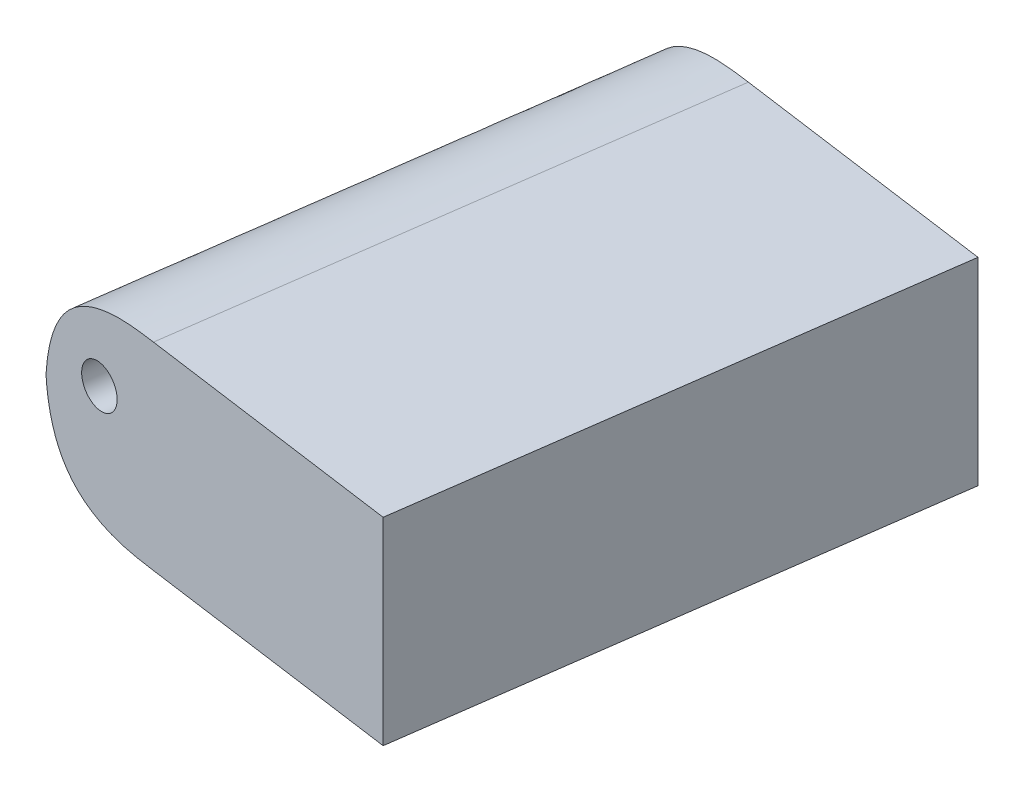
ISO-10303-21;
HEADER;
FILE_DESCRIPTION(('STEP AP214'),'2;1');
FILE_NAME('part.step','',(''),(''),'','','');
FILE_SCHEMA(('AUTOMOTIVE_DESIGN { 1 0 10303 214 1 1 1 1 }'));
ENDSEC;
DATA;
#1=APPLICATION_CONTEXT('core data for automotive mechanical design processes');
#2=APPLICATION_PROTOCOL_DEFINITION('international standard','automotive_design',2000,#1);
#3=PRODUCT_CONTEXT('',#1,'mechanical');
#4=PRODUCT('Part','Part','',(#3));
#5=PRODUCT_RELATED_PRODUCT_CATEGORY('part','',(#4));
#6=PRODUCT_DEFINITION_FORMATION('','',#4);
#7=PRODUCT_DEFINITION_CONTEXT('part definition',#1,'design');
#8=PRODUCT_DEFINITION('design','',#6,#7);
#9=PRODUCT_DEFINITION_SHAPE('','',#8);
#10=(LENGTH_UNIT() NAMED_UNIT(*) SI_UNIT(.MILLI.,.METRE.));
#11=(NAMED_UNIT(*) PLANE_ANGLE_UNIT() SI_UNIT($,.RADIAN.));
#12=(NAMED_UNIT(*) SI_UNIT($,.STERADIAN.) SOLID_ANGLE_UNIT());
#13=UNCERTAINTY_MEASURE_WITH_UNIT(LENGTH_MEASURE(1.E-05),#10,'distance_accuracy_value','');
#14=(GEOMETRIC_REPRESENTATION_CONTEXT(3) GLOBAL_UNCERTAINTY_ASSIGNED_CONTEXT((#13)) GLOBAL_UNIT_ASSIGNED_CONTEXT((#10,
#11,#12)) REPRESENTATION_CONTEXT('',''));
#15=CARTESIAN_POINT('',(0.,0.,0.));
#16=DIRECTION('',(0.,0.,1.));
#17=DIRECTION('',(1.,0.,0.));
#18=AXIS2_PLACEMENT_3D('',#15,#16,#17);
#19=CARTESIAN_POINT('',(-23.9416188893365,9.525,-6.04046528507022));
#20=DIRECTION('',(-0.990563834972414,0.,-0.137052139146913));
#21=DIRECTION('',(-0.137052139146913,0.,0.990563834972414));
#22=AXIS2_PLACEMENT_3D('',#19,#20,#21);
#23=PLANE('',#22);
#24=DIRECTION('',(0.137052139146913,0.,-0.990563834972414));
#25=VECTOR('',#24,1.);
#26=CARTESIAN_POINT('',(-23.9416188893365,0.,-6.04046528507022));
#27=LINE('',#26,#25);
#28=CARTESIAN_POINT('',(-27.4227432236681,0.,19.1198561232291));
#29=VERTEX_POINT('',#28);
#30=CARTESIAN_POINT('',(-23.9416188893365,0.,-6.04046528507022));
#31=VERTEX_POINT('',#30);
#32=EDGE_CURVE('E125',#29,#31,#27,.T.);
#33=ORIENTED_EDGE('',*,*,#32,.T.);
#34=DIRECTION('',(0.,-1.,0.));
#35=VECTOR('',#34,1.);
#36=CARTESIAN_POINT('',(-23.9416188893365,9.525,-6.04046528507022));
#37=LINE('',#36,#35);
#38=CARTESIAN_POINT('',(-23.9416188893365,9.525,-6.04046528507022));
#39=VERTEX_POINT('',#38);
#40=EDGE_CURVE('E106',#39,#31,#37,.T.);
#41=ORIENTED_EDGE('',*,*,#40,.F.);
#42=DIRECTION('',(0.137052139146913,0.,-0.990563834972414));
#43=VECTOR('',#42,1.);
#44=CARTESIAN_POINT('',(-23.9416188893365,9.525,-6.04046528507022));
#45=LINE('',#44,#43);
#46=CARTESIAN_POINT('',(-27.4227432236681,9.525,19.1198561232291));
#47=VERTEX_POINT('',#46);
#48=EDGE_CURVE('E114',#47,#39,#45,.T.);
#49=ORIENTED_EDGE('',*,*,#48,.F.);
#50=DIRECTION('',(0.,-1.,0.));
#51=VECTOR('',#50,1.);
#52=CARTESIAN_POINT('',(-27.4227432236681,9.525,19.1198561232291));
#53=LINE('',#52,#51);
#54=EDGE_CURVE('E127',#47,#29,#53,.T.);
#55=ORIENTED_EDGE('',*,*,#54,.T.);
#56=EDGE_LOOP('',(#33,#41,#49,#55));
#57=FACE_BOUND('',#56,.T.);
#58=ADVANCED_FACE('F49',(#57),#23,.F.);
#59=CARTESIAN_POINT('',(-42.8118599455609,9.525,-8.65130853581891));
#60=DIRECTION('',(-0.137052139146913,0.,0.990563834972414));
#61=DIRECTION('',(0.990563834972414,0.,0.137052139146913));
#62=AXIS2_PLACEMENT_3D('',#59,#60,#61);
#63=PLANE('',#62);
#64=CARTESIAN_POINT('',(-39.7967519465306,5.96899999999997,-8.23414511188111));
#65=DIRECTION('',(0.137052139146914,0.,-0.990563834972414));
#66=DIRECTION('',(-0.990563834972414,0.,-0.137052139146914));
#67=AXIS2_PLACEMENT_3D('',#64,#65,#66);
#68=CIRCLE('',#67,2.032);
#69=CARTESIAN_POINT('',(-41.8095776591946,5.96899999999997,-8.51263505862764));
#70=VERTEX_POINT('',#69);
#71=EDGE_CURVE('E135',#70,#70,#68,.T.);
#72=ORIENTED_EDGE('',*,*,#71,.F.);
#73=EDGE_LOOP('',(#72));
#74=FACE_BOUND('',#73,.T.);
#75=CARTESIAN_POINT('',(-42.8118599455608,6.096,-8.65130853582021));
#76=CARTESIAN_POINT('',(-42.8118599455549,5.07066467784526,-8.65130853581939));
#77=CARTESIAN_POINT('',(-42.8118599455549,4.04532935569003,-8.65130853581939));
#78=CARTESIAN_POINT('',(-42.3789499266729,1.78547706189416,-8.59141209900776));
#79=CARTESIAN_POINT('',(-41.0432309398884,0.437033943318146,-8.40660508508877));
#80=CARTESIAN_POINT('',(-38.80470298524,-2.28472537805387E-12,-8.09688749406616));
#81=CARTESIAN_POINT('',(-37.7890428964015,0.,-7.95636309482248));
#82=CARTESIAN_POINT('',(-36.773382807563,0.,-7.8158386955788));
#83=B_SPLINE_CURVE_WITH_KNOTS('',5,(#75,#76,#77,#78,#79,#80,#81,#82),.UNSPECIFIED.,.F.,.F.,(6,2,
6),(0.,0.5,1.),.UNSPECIFIED.);
#84=CARTESIAN_POINT('',(-36.7733828075631,0.,-7.81583869557849));
#85=VERTEX_POINT('',#84);
#86=CARTESIAN_POINT('',(-42.7789260117289,4.76250070250676,-8.64675187230784));
#87=VERTEX_POINT('',#86);
#88=EDGE_CURVE('E70',#85,#87,#83,.F.);
#89=ORIENTED_EDGE('',*,*,#88,.T.);
#90=CARTESIAN_POINT('',(-36.7733828075624,9.525,-7.8158386955805));
#91=CARTESIAN_POINT('',(-37.7890428964209,9.525,-7.95636309482418));
#92=CARTESIAN_POINT('',(-38.8047029852795,9.525,-8.09688749406785));
#93=CARTESIAN_POINT('',(-41.0432309398878,9.08796605667236,-8.40660508509113));
#94=CARTESIAN_POINT('',(-42.3789499266521,7.73952293812438,-8.59141209900377));
#95=CARTESIAN_POINT('',(-42.8118599455542,5.47967064431392,-8.65130853581607));
#96=CARTESIAN_POINT('',(-42.8118599455542,4.45433532215667,-8.65130853581607));
#97=CARTESIAN_POINT('',(-42.8118599455612,3.429,-8.65130853581704));
#98=B_SPLINE_CURVE_WITH_KNOTS('',5,(#90,#91,#92,#93,#94,#95,#96,#97),.UNSPECIFIED.,.F.,.F.,(6,2,
6),(0.,0.5,1.),.UNSPECIFIED.);
#99=CARTESIAN_POINT('',(-36.7733828075626,9.525,-7.81583869557843));
#100=VERTEX_POINT('',#99);
#101=EDGE_CURVE('E63',#87,#100,#98,.F.);
#102=ORIENTED_EDGE('',*,*,#101,.T.);
#103=DIRECTION('',(-0.990563834972414,0.,-0.137052139146913));
#104=VECTOR('',#103,1.);
#105=CARTESIAN_POINT('',(-42.8118599455609,9.525,-8.65130853581891));
#106=LINE('',#105,#104);
#107=EDGE_CURVE('E102',#39,#100,#106,.T.);
#108=ORIENTED_EDGE('',*,*,#107,.F.);
#109=ORIENTED_EDGE('',*,*,#40,.T.);
#110=DIRECTION('',(-0.990563834972414,0.,-0.137052139146913));
#111=VECTOR('',#110,1.);
#112=CARTESIAN_POINT('',(-42.8118599455609,0.,-8.65130853581891));
#113=LINE('',#112,#111);
#114=EDGE_CURVE('E146',#31,#85,#113,.T.);
#115=ORIENTED_EDGE('',*,*,#114,.T.);
#116=EDGE_LOOP('',(#89,#102,#108,#109,#115));
#117=FACE_BOUND('',#116,.T.);
#118=ADVANCED_FACE('F104',(#74,#117),#63,.F.);
#119=CARTESIAN_POINT('',(-27.4227432236681,9.525,19.1198561232291));
#120=DIRECTION('',(0.137052139146913,0.,-0.990563834972414));
#121=DIRECTION('',(-0.990563834972414,0.,-0.137052139146913));
#122=AXIS2_PLACEMENT_3D('',#119,#120,#121);
#123=PLANE('',#122);
#124=CARTESIAN_POINT('',(-43.2778762808622,5.96899999999997,16.9261762964182));
#125=DIRECTION('',(0.137052139146913,0.,-0.990563834972414));
#126=DIRECTION('',(-0.990563834972414,0.,-0.137052139146913));
#127=AXIS2_PLACEMENT_3D('',#124,#125,#126);
#128=CIRCLE('',#127,1.00000003200001);
#129=CARTESIAN_POINT('',(-44.2684401475327,5.96899999999997,16.7891241528856));
#130=VERTEX_POINT('',#129);
#131=EDGE_CURVE('E133',#130,#130,#128,.T.);
#132=ORIENTED_EDGE('',*,*,#131,.T.);
#133=EDGE_LOOP('',(#132));
#134=FACE_BOUND('',#133,.T.);
#135=DIRECTION('',(0.990563834972414,0.,0.137052139146913));
#136=VECTOR('',#135,1.);
#137=CARTESIAN_POINT('',(-27.4227432236681,9.525,19.1198561232291));
#138=LINE('',#137,#136);
#139=CARTESIAN_POINT('',(-40.2545071419075,9.525,17.344482712719));
#140=VERTEX_POINT('',#139);
#141=EDGE_CURVE('E113',#140,#47,#138,.T.);
#142=ORIENTED_EDGE('',*,*,#141,.F.);
#143=CARTESIAN_POINT('',(-46.2929842798927,3.429,16.5090128724816));
#144=CARTESIAN_POINT('',(-46.2929842798994,4.45433532214521,16.5090128724807));
#145=CARTESIAN_POINT('',(-46.2929842798994,5.47967064429194,16.5090128724807));
#146=CARTESIAN_POINT('',(-45.8600742609668,7.73952293811673,16.5689093093006));
#147=CARTESIAN_POINT('',(-44.5243552742101,9.08796605668191,16.7537163232018));
#148=CARTESIAN_POINT('',(-42.2858273195941,9.525,17.0634339142327));
#149=CARTESIAN_POINT('',(-41.2701672307509,9.525,17.2039583134764));
#150=CARTESIAN_POINT('',(-40.2545071419076,9.525,17.3444827127201));
#151=B_SPLINE_CURVE_WITH_KNOTS('',5,(#143,#144,#145,#146,#147,#148,#149,#150),.UNSPECIFIED.,.F.,
.F.,(6,2,6),(0.,0.5,1.),.UNSPECIFIED.);
#152=CARTESIAN_POINT('',(-46.2600539076306,4.76250261604928,16.5135690432208));
#153=VERTEX_POINT('',#152);
#154=EDGE_CURVE('E220',#140,#153,#151,.F.);
#155=ORIENTED_EDGE('',*,*,#154,.T.);
#156=CARTESIAN_POINT('',(-40.2545071419079,0.,17.3444827127202));
#157=CARTESIAN_POINT('',(-41.2701672307502,0.,17.2039583134765));
#158=CARTESIAN_POINT('',(-42.2858273195926,1.69313834773275E-12,17.0634339142328));
#159=CARTESIAN_POINT('',(-44.5243552742104,0.437033943321013,16.753716323216));
#160=CARTESIAN_POINT('',(-45.8600742609681,1.7854770618834,16.5689093092865));
#161=CARTESIAN_POINT('',(-46.2929842798998,4.04532935570675,16.5090128724805));
#162=CARTESIAN_POINT('',(-46.2929842798998,5.07066467785339,16.5090128724805));
#163=CARTESIAN_POINT('',(-46.2929842798927,6.096,16.5090128724815));
#164=B_SPLINE_CURVE_WITH_KNOTS('',5,(#156,#157,#158,#159,#160,#161,#162,#163),.UNSPECIFIED.,.F.,
.F.,(6,2,6),(0.,0.5,1.),.UNSPECIFIED.);
#165=CARTESIAN_POINT('',(-40.2545071419078,0.,17.344482712719));
#166=VERTEX_POINT('',#165);
#167=EDGE_CURVE('E129',#153,#166,#164,.F.);
#168=ORIENTED_EDGE('',*,*,#167,.T.);
#169=DIRECTION('',(0.990563834972414,0.,0.137052139146913));
#170=VECTOR('',#169,1.);
#171=CARTESIAN_POINT('',(-27.4227432236681,0.,19.1198561232291));
#172=LINE('',#171,#170);
#173=EDGE_CURVE('E122',#166,#29,#172,.T.);
#174=ORIENTED_EDGE('',*,*,#173,.T.);
#175=ORIENTED_EDGE('',*,*,#54,.F.);
#176=EDGE_LOOP('',(#142,#155,#168,#174,#175));
#177=FACE_BOUND('',#176,.T.);
#178=ADVANCED_FACE('F169',(#134,#177),#123,.F.);
#179=CARTESIAN_POINT('',(0.,9.525,0.));
#180=DIRECTION('',(0.,-1.,0.));
#181=DIRECTION('',(0.,0.,-1.));
#182=AXIS2_PLACEMENT_3D('',#179,#180,#181);
#183=PLANE('',#182);
#184=ORIENTED_EDGE('',*,*,#107,.T.);
#185=CARTESIAN_POINT('',(-40.4285633586173,9.525,18.602498783135));
#186=CARTESIAN_POINT('',(-39.1521511027523,9.525,9.3770476000811));
#187=CARTESIAN_POINT('',(-37.8757388467186,9.525,0.151596417051413));
#188=CARTESIAN_POINT('',(-36.5993265908525,9.525,-9.07385476599429));
#189=B_SPLINE_CURVE_WITH_KNOTS('',3,(#185,#186,#187,#188),.UNSPECIFIED.,.F.,.F.,(4,4),
(-0.00397221637437318,0.0239677836256268),.UNSPECIFIED.);
#190=EDGE_CURVE('E126',#100,#140,#189,.F.);
#191=ORIENTED_EDGE('',*,*,#190,.T.);
#192=ORIENTED_EDGE('',*,*,#141,.T.);
#193=ORIENTED_EDGE('',*,*,#48,.T.);
#194=EDGE_LOOP('',(#184,#191,#192,#193));
#195=FACE_BOUND('',#194,.T.);
#196=ADVANCED_FACE('F117',(#195),#183,.F.);
#197=CARTESIAN_POINT('',(0.,0.,0.));
#198=DIRECTION('',(0.,-1.,0.));
#199=DIRECTION('',(0.,0.,-1.));
#200=AXIS2_PLACEMENT_3D('',#197,#198,#199);
#201=PLANE('',#200);
#202=ORIENTED_EDGE('',*,*,#173,.F.);
#203=CARTESIAN_POINT('',(-36.5993265908525,0.,-9.0738547659943));
#204=CARTESIAN_POINT('',(-37.8757388467189,0.,0.151596417029174));
#205=CARTESIAN_POINT('',(-39.1521511027523,0.,9.37704760006494));
#206=CARTESIAN_POINT('',(-40.4285633586173,0.,18.602498783135));
#207=B_SPLINE_CURVE_WITH_KNOTS('',3,(#203,#204,#205,#206),.UNSPECIFIED.,.F.,.F.,(4,4),(-0.02667,
0.00127),.UNSPECIFIED.);
#208=EDGE_CURVE('E11',#166,#85,#207,.F.);
#209=ORIENTED_EDGE('',*,*,#208,.T.);
#210=ORIENTED_EDGE('',*,*,#114,.F.);
#211=ORIENTED_EDGE('',*,*,#32,.F.);
#212=EDGE_LOOP('',(#202,#209,#210,#211));
#213=FACE_BOUND('',#212,.T.);
#214=ADVANCED_FACE('F186',(#213),#201,.T.);
#215=CARTESIAN_POINT('',(-40.1667927222273,5.96899999999997,-5.5596227574556));
#216=DIRECTION('',(0.137052139146914,0.,-0.990563834972413));
#217=DIRECTION('',(-0.990563834972414,0.,-0.137052139146914));
#218=AXIS2_PLACEMENT_3D('',#215,#216,#217);
#219=CYLINDRICAL_SURFACE('',#218,2.032);
#220=CARTESIAN_POINT('',(-40.1667927222273,5.96899999999997,-5.5596227574556));
#221=DIRECTION('',(0.137052139146914,0.,-0.990563834972414));
#222=DIRECTION('',(-0.990563834972414,0.,-0.137052139146914));
#223=AXIS2_PLACEMENT_3D('',#220,#221,#222);
#224=CIRCLE('',#223,2.032);
#225=CARTESIAN_POINT('',(-42.1796184348912,5.96899999999997,-5.83811270420212));
#226=VERTEX_POINT('',#225);
#227=EDGE_CURVE('E147',#226,#226,#224,.T.);
#228=CARTESIAN_POINT('',(-42.1796184348912,5.96899999999997,-5.83811270420212));
#229=CARTESIAN_POINT('',(-42.1757638434777,5.96899999999997,-5.86597231206072));
#230=CARTESIAN_POINT('',(-42.1719092520642,5.96899999999997,-5.89383191991932));
#231=CARTESIAN_POINT('',(-42.1642000692372,5.96899999999997,-5.94955113563652));
#232=CARTESIAN_POINT('',(-42.1603454778237,5.96899999999997,-5.97741074349512));
#233=CARTESIAN_POINT('',(-42.1526362949967,5.96899999999997,-6.03312995921232));
#234=CARTESIAN_POINT('',(-42.1487817035832,5.96899999999997,-6.06098956707092));
#235=CARTESIAN_POINT('',(-42.1410725207562,5.96899999999997,-6.11670878278811));
#236=CARTESIAN_POINT('',(-42.1372179293427,5.96899999999997,-6.14456839064671));
#237=CARTESIAN_POINT('',(-42.1295087465157,5.96899999999997,-6.20028760636391));
#238=CARTESIAN_POINT('',(-42.1256541551021,5.96899999999997,-6.22814721422251));
#239=CARTESIAN_POINT('',(-42.1179449722751,5.96899999999997,-6.28386642993971));
#240=CARTESIAN_POINT('',(-42.1140903808616,5.96899999999997,-6.31172603779831));
#241=CARTESIAN_POINT('',(-42.1063811980346,5.96899999999997,-6.36744525351551));
#242=CARTESIAN_POINT('',(-42.1025266066211,5.96899999999997,-6.3953048613741));
#243=CARTESIAN_POINT('',(-42.0948174237941,5.96899999999997,-6.4510240770913));
#244=CARTESIAN_POINT('',(-42.0909628323806,5.96899999999997,-6.4788836849499));
#245=CARTESIAN_POINT('',(-42.0832536495536,5.96899999999997,-6.5346029006671));
#246=CARTESIAN_POINT('',(-42.0793990581401,5.96899999999997,-6.5624625085257));
#247=CARTESIAN_POINT('',(-42.071689875313,5.96899999999997,-6.6181817242429));
#248=CARTESIAN_POINT('',(-42.0678352838995,5.96899999999997,-6.6460413321015));
#249=CARTESIAN_POINT('',(-42.0601261010725,5.96899999999997,-6.7017605478187));
#250=CARTESIAN_POINT('',(-42.056271509659,5.96899999999997,-6.7296201556773));
#251=CARTESIAN_POINT('',(-42.048562326832,5.96899999999997,-6.78533937139449));
#252=CARTESIAN_POINT('',(-42.0447077354185,5.96899999999997,-6.81319897925309));
#253=CARTESIAN_POINT('',(-42.0369985525915,5.96899999999997,-6.86891819497029));
#254=CARTESIAN_POINT('',(-42.033143961178,5.96899999999997,-6.89677780282889));
#255=CARTESIAN_POINT('',(-42.025434778351,5.96899999999997,-6.95249701854609));
#256=CARTESIAN_POINT('',(-42.0215801869375,5.96899999999997,-6.98035662640469));
#257=CARTESIAN_POINT('',(-42.0138710041104,5.96899999999997,-7.03607584212189));
#258=CARTESIAN_POINT('',(-42.0100164126969,5.96899999999997,-7.06393544998048));
#259=CARTESIAN_POINT('',(-42.0023072298699,5.96899999999997,-7.11965466569768));
#260=CARTESIAN_POINT('',(-41.9984526384564,5.96899999999997,-7.14751427355628));
#261=CARTESIAN_POINT('',(-41.9907434556294,5.96899999999997,-7.20323348927348));
#262=CARTESIAN_POINT('',(-41.9868888642159,5.96899999999997,-7.23109309713208));
#263=CARTESIAN_POINT('',(-41.9791796813889,5.96899999999997,-7.28681231284928));
#264=CARTESIAN_POINT('',(-41.9753250899754,5.96899999999997,-7.31467192070788));
#265=CARTESIAN_POINT('',(-41.9676159071484,5.96899999999997,-7.37039113642508));
#266=CARTESIAN_POINT('',(-41.9637613157348,5.96899999999997,-7.39825074428367));
#267=CARTESIAN_POINT('',(-41.9560521329078,5.96899999999997,-7.45396996000087));
#268=CARTESIAN_POINT('',(-41.9521975414943,5.96899999999997,-7.48182956785947));
#269=CARTESIAN_POINT('',(-41.9444883586673,5.96899999999997,-7.53754878357667));
#270=CARTESIAN_POINT('',(-41.9406337672538,5.96899999999997,-7.56540839143527));
#271=CARTESIAN_POINT('',(-41.9329245844268,5.96899999999997,-7.62112760715247));
#272=CARTESIAN_POINT('',(-41.9290699930133,5.96899999999997,-7.64898721501107));
#273=CARTESIAN_POINT('',(-41.9213608101863,5.96899999999997,-7.70470643072827));
#274=CARTESIAN_POINT('',(-41.9175062187728,5.96899999999997,-7.73256603858686));
#275=CARTESIAN_POINT('',(-41.9097970359458,5.96899999999997,-7.78828525430406));
#276=CARTESIAN_POINT('',(-41.9059424445322,5.96899999999997,-7.81614486216266));
#277=CARTESIAN_POINT('',(-41.8982332617052,5.96899999999997,-7.87186407787986));
#278=CARTESIAN_POINT('',(-41.8943786702917,5.96899999999997,-7.89972368573846));
#279=CARTESIAN_POINT('',(-41.8866694874647,5.96899999999997,-7.95544290145566));
#280=CARTESIAN_POINT('',(-41.8828148960512,5.96899999999997,-7.98330250931426));
#281=CARTESIAN_POINT('',(-41.8751057132242,5.96899999999997,-8.03902172503145));
#282=CARTESIAN_POINT('',(-41.8712511218107,5.96899999999997,-8.06688133289005));
#283=CARTESIAN_POINT('',(-41.8635419389837,5.96899999999997,-8.12260054860725));
#284=CARTESIAN_POINT('',(-41.8596873475702,5.96899999999997,-8.15046015646585));
#285=CARTESIAN_POINT('',(-41.8519781647432,5.96899999999997,-8.20617937218305));
#286=CARTESIAN_POINT('',(-41.8481235733296,5.96899999999997,-8.23403898004165));
#287=CARTESIAN_POINT('',(-41.8404143905026,5.96899999999997,-8.28975819575885));
#288=CARTESIAN_POINT('',(-41.8365597990891,5.96899999999997,-8.31761780361745));
#289=CARTESIAN_POINT('',(-41.8288506162621,5.96899999999997,-8.37333701933465));
#290=CARTESIAN_POINT('',(-41.8249960248486,5.96899999999997,-8.40119662719324));
#291=CARTESIAN_POINT('',(-41.8172868420216,5.96899999999997,-8.45691584291044));
#292=CARTESIAN_POINT('',(-41.8134322506081,5.96899999999997,-8.48477545076904));
#293=CARTESIAN_POINT('',(-41.8095776591946,5.96899999999997,-8.51263505862764));
#294=B_SPLINE_CURVE_WITH_KNOTS('',3,(#228,#229,#230,#231,#232,#233,#234,#235,#236,#237,#238,
#239,#240,#241,#242,#243,#244,#245,#246,#247,#248,#249,#250,#251,#252,#253,#254,#255,#256,#257,
#258,#259,#260,#261,#262,#263,#264,#265,#266,#267,#268,#269,#270,#271,#272,#273,#274,#275,#276,
#277,#278,#279,#280,#281,#282,#283,#284,#285,#286,#287,#288,#289,#290,#291,#292,#293),
.UNSPECIFIED.,.F.,.F.,(4,2,2,2,2,2,2,2,2,2,2,2,2,2,2,2,2,2,2,2,2,2,2,2,2,2,2,2,2,2,2,2,4),(0.,
0.084375,0.168750000000001,0.253125,0.337500000000001,0.421875,0.50625,0.590625,0.675,0.759375,
0.843750000000001,0.928125000000001,1.0125,1.096875,1.18125,1.265625,1.35,1.434375,1.51875,
1.603125,1.6875,1.771875,1.85625,1.940625,2.025,2.109375,2.19375,2.278125,2.3625,2.446875,
2.53125,2.615625,2.7),.UNSPECIFIED.);
#295=EDGE_CURVE('BSEAM195',#226,#70,#294,.T.);
#296=ORIENTED_EDGE('',*,*,#227,.F.);
#297=ORIENTED_EDGE('',*,*,#71,.T.);
#298=ORIENTED_EDGE('',*,*,#295,.T.);
#299=ORIENTED_EDGE('',*,*,#295,.F.);
#300=EDGE_LOOP('',(#296,#298,#297,#299));
#301=FACE_BOUND('',#300,.T.);
#302=ADVANCED_FACE('F195',(#301),#219,.F.);
#303=CARTESIAN_POINT('',(-40.1667927222273,5.96899999999997,-5.5596227574556));
#304=DIRECTION('',(0.137052139146914,0.,-0.990563834972414));
#305=DIRECTION('',(-0.990563834972414,0.,-0.137052139146914));
#306=AXIS2_PLACEMENT_3D('',#303,#304,#305);
#307=PLANE('',#306);
#308=CARTESIAN_POINT('',(-40.1667927222273,5.96899999999997,-5.55962275745559));
#309=DIRECTION('',(0.137052139146914,0.,-0.990563834972414));
#310=DIRECTION('',(-0.990563834972414,0.,-0.137052139146914));
#311=AXIS2_PLACEMENT_3D('',#308,#309,#310);
#312=CIRCLE('',#311,1.00000003200001);
#313=CARTESIAN_POINT('',(-41.1573565888978,5.96899999999997,-5.69667490098818));
#314=VERTEX_POINT('',#313);
#315=EDGE_CURVE('E136',#314,#314,#312,.T.);
#316=ORIENTED_EDGE('',*,*,#315,.F.);
#317=EDGE_LOOP('',(#316));
#318=FACE_BOUND('',#317,.T.);
#319=ORIENTED_EDGE('',*,*,#227,.T.);
#320=EDGE_LOOP('',(#319));
#321=FACE_BOUND('',#320,.T.);
#322=ADVANCED_FACE('F289',(#318,#321),#307,.T.);
#323=CARTESIAN_POINT('',(-43.6323214691913,5.96899999999997,19.4879793242597));
#324=DIRECTION('',(0.137052139146914,0.,-0.990563834972414));
#325=DIRECTION('',(-0.990563834972414,0.,-0.137052139146914));
#326=AXIS2_PLACEMENT_3D('',#323,#324,#325);
#327=CYLINDRICAL_SURFACE('',#326,1.00000003200001);
#328=ORIENTED_EDGE('',*,*,#315,.T.);
#329=EDGE_LOOP('',(#328));
#330=FACE_BOUND('',#329,.T.);
#331=ORIENTED_EDGE('',*,*,#131,.F.);
#332=EDGE_LOOP('',(#331));
#333=FACE_BOUND('',#332,.T.);
#334=ADVANCED_FACE('F277',(#330,#333),#327,.F.);
#335=CARTESIAN_POINT('',(-40.4285633586173,0.,18.602498783135));
#336=CARTESIAN_POINT('',(-39.1521511027523,0.,9.37704760006494));
#337=CARTESIAN_POINT('',(-37.8757388467189,0.,0.151596417029174));
#338=CARTESIAN_POINT('',(-36.5993265908525,0.,-9.0738547659943));
#339=CARTESIAN_POINT('',(-41.4442234474598,0.,18.4619743838913));
#340=CARTESIAN_POINT('',(-40.1678111915948,0.,9.23652320082126));
#341=CARTESIAN_POINT('',(-38.8913989355291,0.,0.0110720177854986));
#342=CARTESIAN_POINT('',(-37.614986679695,0.,-9.21437916523797));
#343=CARTESIAN_POINT('',(-42.4598835363023,0.,18.3214499846476));
#344=CARTESIAN_POINT('',(-41.1834712804373,1.45398667064499E-11,9.09599880157759));
#345=CARTESIAN_POINT('',(-39.9070590243393,-1.90838881156135E-11,-0.129452381458177));
#346=CARTESIAN_POINT('',(-38.6306467685375,0.,-9.35490356448165));
#347=CARTESIAN_POINT('',(-44.6984114909313,0.437033943320762,18.0117323936247));
#348=CARTESIAN_POINT('',(-43.4219992349693,0.437033943323791,8.78628121060316));
#349=CARTESIAN_POINT('',(-42.1455869791298,0.437033943299557,-0.439169972481077));
#350=CARTESIAN_POINT('',(-40.8691747231665,0.437033943320762,-9.66462115550455));
#351=CARTESIAN_POINT('',(-46.0341304777002,1.78547706188681,17.8269253797073));
#352=CARTESIAN_POINT('',(-44.7577182216413,1.78547706185652,8.60147419658881));
#353=CARTESIAN_POINT('',(-43.481305966028,1.78547706194739,-0.623976986406566));
#354=CARTESIAN_POINT('',(-42.2048937099354,1.78547706188681,-9.84942816942196));
#355=CARTESIAN_POINT('',(-46.4670404966091,4.04532935569812,17.7670289428954));
#356=CARTESIAN_POINT('',(-45.1906282407441,4.04532935577082,8.54157775982536));
#357=CARTESIAN_POINT('',(-43.9142159847108,4.04532935562947,-0.683873423218489));
#358=CARTESIAN_POINT('',(-42.6378037288444,4.04532935569813,-9.90932460623388));
#359=CARTESIAN_POINT('',(-46.4670404966091,5.07066467784906,17.7670289428954));
#360=CARTESIAN_POINT('',(-45.1906282407441,5.07066467788541,8.54157775982536));
#361=CARTESIAN_POINT('',(-43.9142159847108,5.07066467781675,-0.683873423218489));
#362=CARTESIAN_POINT('',(-42.6378037288444,5.07066467784906,-9.90932460623388));
#363=CARTESIAN_POINT('',(-46.4670404966091,6.096,17.7670289428954));
#364=CARTESIAN_POINT('',(-45.1906282406849,6.096,8.54157775983355));
#365=CARTESIAN_POINT('',(-43.9142159847612,6.096,-0.683873423225463));
#366=CARTESIAN_POINT('',(-42.6378037288444,6.096,-9.90932460623388));
#367=B_SPLINE_SURFACE_WITH_KNOTS('',5,3,((#335,#336,#337,#338),(#339,#340,#341,#342),(#343,#344,
#345,#346),(#347,#348,#349,#350),(#351,#352,#353,#354),(#355,#356,#357,#358),(#359,#360,#361,
#362),(#363,#364,#365,#366)),.UNSPECIFIED.,.F.,.F.,.F.,(6,2,6),(4,4),(0.,0.5,1.),(-0.02667,
0.00127),.UNSPECIFIED.);
#368=CARTESIAN_POINT('',(-42.6048783595175,4.76249999996947,-9.9047691276881));
#369=CARTESIAN_POINT('',(-43.881290615401,4.76250000002585,-0.679317944612065));
#370=CARTESIAN_POINT('',(-45.1577028713932,4.76249999992453,8.5461332383924));
#371=CARTESIAN_POINT('',(-46.4341151272823,4.76249999996948,17.7715844214412));
#372=B_SPLINE_CURVE_WITH_KNOTS('',3,(#368,#369,#370,#371),.UNSPECIFIED.,.F.,.F.,(4,4),
(-0.00397221637437317,0.0239677836256268),.UNSPECIFIED.);
#373=EDGE_CURVE('E224',#87,#153,#372,.T.);
#374=ORIENTED_EDGE('',*,*,#373,.F.);
#375=ORIENTED_EDGE('',*,*,#88,.F.);
#376=ORIENTED_EDGE('',*,*,#208,.F.);
#377=ORIENTED_EDGE('',*,*,#167,.F.);
#378=EDGE_LOOP('',(#374,#375,#376,#377));
#379=FACE_BOUND('',#378,.T.);
#380=ADVANCED_FACE('F52',(#379),#367,.T.);
#381=CARTESIAN_POINT('',(-36.5993265908525,9.525,-9.07385476599429));
#382=CARTESIAN_POINT('',(-37.8757388467186,9.525,0.151596417051413));
#383=CARTESIAN_POINT('',(-39.1521511027523,9.525,9.3770476000811));
#384=CARTESIAN_POINT('',(-40.4285633586173,9.525,18.602498783135));
#385=CARTESIAN_POINT('',(-37.614986679695,9.525,-9.21437916523797));
#386=CARTESIAN_POINT('',(-38.8913989356904,9.525,0.0110720178077366));
#387=CARTESIAN_POINT('',(-40.1678111915948,9.525,9.23652320083742));
#388=CARTESIAN_POINT('',(-41.4442234474598,9.525,18.4619743838913));
#389=CARTESIAN_POINT('',(-38.6306467685375,9.525,-9.35490356448165));
#390=CARTESIAN_POINT('',(-39.9070590246622,9.525,-0.129452381435938));
#391=CARTESIAN_POINT('',(-41.1834712804373,9.525,9.09599880159375));
#392=CARTESIAN_POINT('',(-42.4598835363023,9.525,18.3214499846476));
#393=CARTESIAN_POINT('',(-40.8691747231665,9.08796605667924,-9.66462115550455));
#394=CARTESIAN_POINT('',(-42.1455869791295,9.08796605662269,-0.43916997245884));
#395=CARTESIAN_POINT('',(-43.4219992349693,9.08796605670347,8.78628121050623));
#396=CARTESIAN_POINT('',(-44.6984114909313,9.08796605667924,18.0117323936247));
#397=CARTESIAN_POINT('',(-42.2048937099354,7.73952293811319,-9.84942816942196));
#398=CARTESIAN_POINT('',(-43.4813059658662,7.73952293820205,-0.623976986343936));
#399=CARTESIAN_POINT('',(-44.7577182216413,7.73952293813743,8.60147419671806));
#400=CARTESIAN_POINT('',(-46.0341304777002,7.73952293811319,17.8269253797073));
#401=CARTESIAN_POINT('',(-42.6378037288444,5.47967064430187,-9.90932460623388));
#402=CARTESIAN_POINT('',(-43.9142159847105,5.47967064440285,-0.683873423155859));
#403=CARTESIAN_POINT('',(-45.1906282407441,5.47967064421706,8.54157775984151));
#404=CARTESIAN_POINT('',(-46.4670404966091,5.47967064430188,17.7670289428954));
#405=CARTESIAN_POINT('',(-42.6378037288444,4.45433532215094,-9.90932460623388));
#406=CARTESIAN_POINT('',(-43.9142159847105,4.4543353221994,-0.683873423155859));
#407=CARTESIAN_POINT('',(-45.1906282407441,4.45433532210247,8.54157775984151));
#408=CARTESIAN_POINT('',(-46.4670404966091,4.45433532215094,17.7670289428954));
#409=CARTESIAN_POINT('',(-42.6378037288444,3.429,-9.90932460623388));
#410=CARTESIAN_POINT('',(-43.9142159847697,3.429,-0.683873423164046));
#411=CARTESIAN_POINT('',(-45.1906282406871,3.429,8.5415777598494));
#412=CARTESIAN_POINT('',(-46.4670404966091,3.429,17.7670289428954));
#413=B_SPLINE_SURFACE_WITH_KNOTS('',5,3,((#381,#382,#383,#384),(#385,#386,#387,#388),(#389,#390,
#391,#392),(#393,#394,#395,#396),(#397,#398,#399,#400),(#401,#402,#403,#404),(#405,#406,#407,
#408),(#409,#410,#411,#412)),.UNSPECIFIED.,.F.,.F.,.F.,(6,2,6),(4,4),(0.,0.5,1.),
(-0.00397221637437317,0.0239677836256268),.UNSPECIFIED.);
#414=ORIENTED_EDGE('',*,*,#101,.F.);
#415=ORIENTED_EDGE('',*,*,#373,.T.);
#416=ORIENTED_EDGE('',*,*,#154,.F.);
#417=ORIENTED_EDGE('',*,*,#190,.F.);
#418=EDGE_LOOP('',(#414,#415,#416,#417));
#419=FACE_BOUND('',#418,.T.);
#420=ADVANCED_FACE('F229',(#419),#413,.T.);
#421=CLOSED_SHELL('',(#58,#118,#178,#196,#214,#302,#322,#334,#380,#420));
#422=MANIFOLD_SOLID_BREP('B2',#421);
#423=ADVANCED_BREP_SHAPE_REPRESENTATION('',(#18,#422),#14);
#424=SHAPE_DEFINITION_REPRESENTATION(#9,#423);
ENDSEC;
END-ISO-10303-21;
